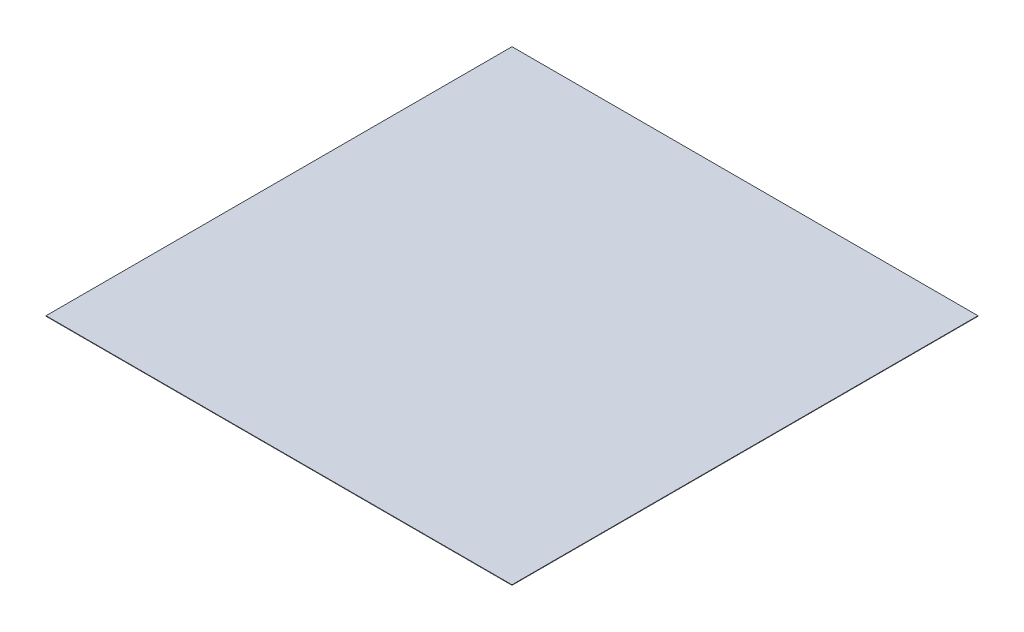
ISO-10303-21;
HEADER;
FILE_DESCRIPTION(('STEP AP214'),'2;1');
FILE_NAME('part.step','',(''),(''),'','','');
FILE_SCHEMA(('AUTOMOTIVE_DESIGN { 1 0 10303 214 1 1 1 1 }'));
ENDSEC;
DATA;
#1=APPLICATION_CONTEXT('core data for automotive mechanical design processes');
#2=APPLICATION_PROTOCOL_DEFINITION('international standard','automotive_design',2000,#1);
#3=PRODUCT_CONTEXT('',#1,'mechanical');
#4=PRODUCT('Part','Part','',(#3));
#5=PRODUCT_RELATED_PRODUCT_CATEGORY('part','',(#4));
#6=PRODUCT_DEFINITION_FORMATION('','',#4);
#7=PRODUCT_DEFINITION_CONTEXT('part definition',#1,'design');
#8=PRODUCT_DEFINITION('design','',#6,#7);
#9=PRODUCT_DEFINITION_SHAPE('','',#8);
#10=(LENGTH_UNIT() NAMED_UNIT(*) SI_UNIT(.MILLI.,.METRE.));
#11=(NAMED_UNIT(*) PLANE_ANGLE_UNIT() SI_UNIT($,.RADIAN.));
#12=(NAMED_UNIT(*) SI_UNIT($,.STERADIAN.) SOLID_ANGLE_UNIT());
#13=UNCERTAINTY_MEASURE_WITH_UNIT(LENGTH_MEASURE(1.E-05),#10,'distance_accuracy_value','');
#14=(GEOMETRIC_REPRESENTATION_CONTEXT(3) GLOBAL_UNCERTAINTY_ASSIGNED_CONTEXT((#13)) GLOBAL_UNIT_ASSIGNED_CONTEXT((#10,
#11,#12)) REPRESENTATION_CONTEXT('',''));
#15=CARTESIAN_POINT('',(0.,0.,0.));
#16=DIRECTION('',(0.,0.,1.));
#17=DIRECTION('',(1.,0.,0.));
#18=AXIS2_PLACEMENT_3D('',#15,#16,#17);
#19=CARTESIAN_POINT('',(0.,0.,1000.));
#20=DIRECTION('',(-1.,0.,0.));
#21=DIRECTION('',(0.,0.,1.));
#22=AXIS2_PLACEMENT_3D('',#19,#20,#21);
#23=PLANE('',#22);
#24=DIRECTION('',(0.,1.,0.));
#25=VECTOR('',#24,1.);
#26=CARTESIAN_POINT('',(0.,0.,0.));
#27=LINE('',#26,#25);
#28=CARTESIAN_POINT('',(0.,0.,0.));
#29=VERTEX_POINT('',#28);
#30=CARTESIAN_POINT('',(0.,1.,0.));
#31=VERTEX_POINT('',#30);
#32=EDGE_CURVE('E103',#29,#31,#27,.T.);
#33=ORIENTED_EDGE('',*,*,#32,.F.);
#34=DIRECTION('',(0.,0.,-1.));
#35=VECTOR('',#34,1.);
#36=CARTESIAN_POINT('',(0.,0.,1000.));
#37=LINE('',#36,#35);
#38=CARTESIAN_POINT('',(0.,0.,1000.));
#39=VERTEX_POINT('',#38);
#40=EDGE_CURVE('E11',#39,#29,#37,.T.);
#41=ORIENTED_EDGE('',*,*,#40,.F.);
#42=DIRECTION('',(0.,1.,0.));
#43=VECTOR('',#42,1.);
#44=CARTESIAN_POINT('',(0.,0.,1000.));
#45=LINE('',#44,#43);
#46=CARTESIAN_POINT('',(0.,1.,1000.));
#47=VERTEX_POINT('',#46);
#48=EDGE_CURVE('E98',#39,#47,#45,.T.);
#49=ORIENTED_EDGE('',*,*,#48,.T.);
#50=DIRECTION('',(0.,0.,-1.));
#51=VECTOR('',#50,1.);
#52=CARTESIAN_POINT('',(0.,1.,1000.));
#53=LINE('',#52,#51);
#54=EDGE_CURVE('E41',#47,#31,#53,.T.);
#55=ORIENTED_EDGE('',*,*,#54,.T.);
#56=EDGE_LOOP('',(#33,#41,#49,#55));
#57=FACE_BOUND('',#56,.T.);
#58=ADVANCED_FACE('F38',(#57),#23,.T.);
#59=CARTESIAN_POINT('',(0.,0.,1000.));
#60=DIRECTION('',(0.,1.,0.));
#61=DIRECTION('',(0.,0.,1.));
#62=AXIS2_PLACEMENT_3D('',#59,#60,#61);
#63=PLANE('',#62);
#64=DIRECTION('',(1.,0.,0.));
#65=VECTOR('',#64,1.);
#66=CARTESIAN_POINT('',(0.,0.,0.));
#67=LINE('',#66,#65);
#68=CARTESIAN_POINT('',(1000.,0.,0.));
#69=VERTEX_POINT('',#68);
#70=EDGE_CURVE('E71',#29,#69,#67,.T.);
#71=ORIENTED_EDGE('',*,*,#70,.T.);
#72=DIRECTION('',(0.,0.,-1.));
#73=VECTOR('',#72,1.);
#74=CARTESIAN_POINT('',(1000.,0.,1000.));
#75=LINE('',#74,#73);
#76=CARTESIAN_POINT('',(1000.,0.,1000.));
#77=VERTEX_POINT('',#76);
#78=EDGE_CURVE('E47',#77,#69,#75,.T.);
#79=ORIENTED_EDGE('',*,*,#78,.F.);
#80=DIRECTION('',(1.,0.,0.));
#81=VECTOR('',#80,1.);
#82=CARTESIAN_POINT('',(0.,0.,1000.));
#83=LINE('',#82,#81);
#84=EDGE_CURVE('E88',#39,#77,#83,.T.);
#85=ORIENTED_EDGE('',*,*,#84,.F.);
#86=ORIENTED_EDGE('',*,*,#40,.T.);
#87=EDGE_LOOP('',(#71,#79,#85,#86));
#88=FACE_BOUND('',#87,.T.);
#89=ADVANCED_FACE('F113',(#88),#63,.F.);
#90=CARTESIAN_POINT('',(1000.,0.,1000.));
#91=DIRECTION('',(-1.,0.,0.));
#92=DIRECTION('',(0.,0.,1.));
#93=AXIS2_PLACEMENT_3D('',#90,#91,#92);
#94=PLANE('',#93);
#95=DIRECTION('',(0.,1.,0.));
#96=VECTOR('',#95,1.);
#97=CARTESIAN_POINT('',(1000.,0.,0.));
#98=LINE('',#97,#96);
#99=CARTESIAN_POINT('',(1000.,1.,0.));
#100=VERTEX_POINT('',#99);
#101=EDGE_CURVE('E95',#69,#100,#98,.T.);
#102=ORIENTED_EDGE('',*,*,#101,.T.);
#103=DIRECTION('',(0.,0.,-1.));
#104=VECTOR('',#103,1.);
#105=CARTESIAN_POINT('',(1000.,1.,1000.));
#106=LINE('',#105,#104);
#107=CARTESIAN_POINT('',(1000.,1.,1000.));
#108=VERTEX_POINT('',#107);
#109=EDGE_CURVE('E92',#108,#100,#106,.T.);
#110=ORIENTED_EDGE('',*,*,#109,.F.);
#111=DIRECTION('',(0.,1.,0.));
#112=VECTOR('',#111,1.);
#113=CARTESIAN_POINT('',(1000.,0.,1000.));
#114=LINE('',#113,#112);
#115=EDGE_CURVE('E83',#77,#108,#114,.T.);
#116=ORIENTED_EDGE('',*,*,#115,.F.);
#117=ORIENTED_EDGE('',*,*,#78,.T.);
#118=EDGE_LOOP('',(#102,#110,#116,#117));
#119=FACE_BOUND('',#118,.T.);
#120=ADVANCED_FACE('F93',(#119),#94,.F.);
#121=CARTESIAN_POINT('',(0.,1.,1000.));
#122=DIRECTION('',(0.,1.,0.));
#123=DIRECTION('',(0.,0.,1.));
#124=AXIS2_PLACEMENT_3D('',#121,#122,#123);
#125=PLANE('',#124);
#126=DIRECTION('',(1.,0.,0.));
#127=VECTOR('',#126,1.);
#128=CARTESIAN_POINT('',(0.,1.,0.));
#129=LINE('',#128,#127);
#130=EDGE_CURVE('E106',#31,#100,#129,.T.);
#131=ORIENTED_EDGE('',*,*,#130,.F.);
#132=ORIENTED_EDGE('',*,*,#54,.F.);
#133=DIRECTION('',(1.,0.,0.));
#134=VECTOR('',#133,1.);
#135=CARTESIAN_POINT('',(0.,1.,1000.));
#136=LINE('',#135,#134);
#137=EDGE_CURVE('E87',#47,#108,#136,.T.);
#138=ORIENTED_EDGE('',*,*,#137,.T.);
#139=ORIENTED_EDGE('',*,*,#109,.T.);
#140=EDGE_LOOP('',(#131,#132,#138,#139));
#141=FACE_BOUND('',#140,.T.);
#142=ADVANCED_FACE('F97',(#141),#125,.T.);
#143=CARTESIAN_POINT('',(0.,0.,1000.));
#144=DIRECTION('',(0.,0.,-1.));
#145=DIRECTION('',(-1.,0.,0.));
#146=AXIS2_PLACEMENT_3D('',#143,#144,#145);
#147=PLANE('',#146);
#148=ORIENTED_EDGE('',*,*,#48,.F.);
#149=ORIENTED_EDGE('',*,*,#84,.T.);
#150=ORIENTED_EDGE('',*,*,#115,.T.);
#151=ORIENTED_EDGE('',*,*,#137,.F.);
#152=EDGE_LOOP('',(#148,#149,#150,#151));
#153=FACE_BOUND('',#152,.T.);
#154=ADVANCED_FACE('F86',(#153),#147,.F.);
#155=CARTESIAN_POINT('',(0.,0.,0.));
#156=DIRECTION('',(0.,0.,-1.));
#157=DIRECTION('',(-1.,0.,0.));
#158=AXIS2_PLACEMENT_3D('',#155,#156,#157);
#159=PLANE('',#158);
#160=ORIENTED_EDGE('',*,*,#32,.T.);
#161=ORIENTED_EDGE('',*,*,#130,.T.);
#162=ORIENTED_EDGE('',*,*,#101,.F.);
#163=ORIENTED_EDGE('',*,*,#70,.F.);
#164=EDGE_LOOP('',(#160,#161,#162,#163));
#165=FACE_BOUND('',#164,.T.);
#166=ADVANCED_FACE('F111',(#165),#159,.T.);
#167=CLOSED_SHELL('',(#58,#89,#120,#142,#154,#166));
#168=MANIFOLD_SOLID_BREP('B2',#167);
#169=ADVANCED_BREP_SHAPE_REPRESENTATION('',(#18,#168),#14);
#170=SHAPE_DEFINITION_REPRESENTATION(#9,#169);
ENDSEC;
END-ISO-10303-21;
